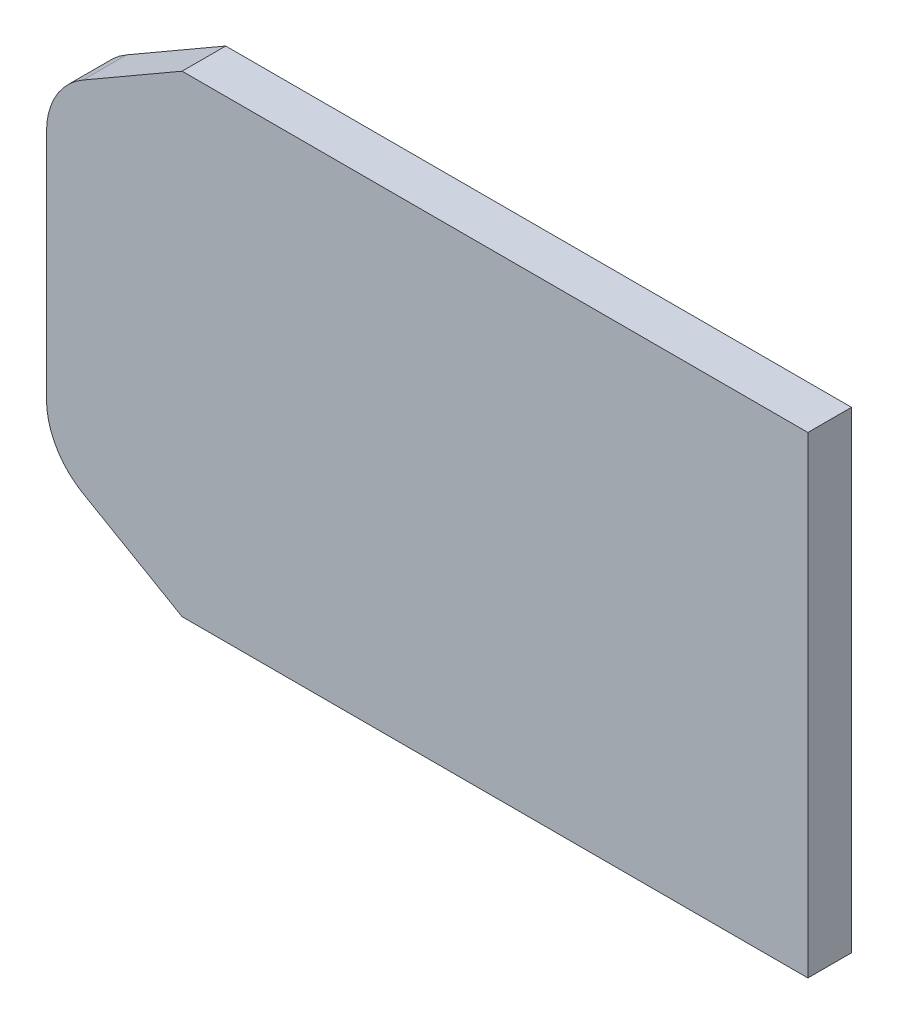
ISO-10303-21;
HEADER;
FILE_DESCRIPTION(('STEP AP214'),'2;1');
FILE_NAME('part.step','',(''),(''),'','','');
FILE_SCHEMA(('AUTOMOTIVE_DESIGN { 1 0 10303 214 1 1 1 1 }'));
ENDSEC;
DATA;
#1=APPLICATION_CONTEXT('core data for automotive mechanical design processes');
#2=APPLICATION_PROTOCOL_DEFINITION('international standard','automotive_design',2000,#1);
#3=PRODUCT_CONTEXT('',#1,'mechanical');
#4=PRODUCT('Part','Part','',(#3));
#5=PRODUCT_RELATED_PRODUCT_CATEGORY('part','',(#4));
#6=PRODUCT_DEFINITION_FORMATION('','',#4);
#7=PRODUCT_DEFINITION_CONTEXT('part definition',#1,'design');
#8=PRODUCT_DEFINITION('design','',#6,#7);
#9=PRODUCT_DEFINITION_SHAPE('','',#8);
#10=(LENGTH_UNIT() NAMED_UNIT(*) SI_UNIT(.MILLI.,.METRE.));
#11=(NAMED_UNIT(*) PLANE_ANGLE_UNIT() SI_UNIT($,.RADIAN.));
#12=(NAMED_UNIT(*) SI_UNIT($,.STERADIAN.) SOLID_ANGLE_UNIT());
#13=UNCERTAINTY_MEASURE_WITH_UNIT(LENGTH_MEASURE(1.E-05),#10,'distance_accuracy_value','');
#14=(GEOMETRIC_REPRESENTATION_CONTEXT(3) GLOBAL_UNCERTAINTY_ASSIGNED_CONTEXT((#13)) GLOBAL_UNIT_ASSIGNED_CONTEXT((#10,
#11,#12)) REPRESENTATION_CONTEXT('',''));
#15=CARTESIAN_POINT('',(0.,0.,0.));
#16=DIRECTION('',(0.,0.,1.));
#17=DIRECTION('',(1.,0.,0.));
#18=AXIS2_PLACEMENT_3D('',#15,#16,#17);
#19=CARTESIAN_POINT('',(-37.7876425318327,242.932576410757,6.));
#20=DIRECTION('',(-1.,0.,0.));
#21=DIRECTION('',(0.,-1.,0.));
#22=AXIS2_PLACEMENT_3D('',#19,#20,#21);
#23=PLANE('',#22);
#24=DIRECTION('',(0.,1.,0.));
#25=VECTOR('',#24,1.);
#26=CARTESIAN_POINT('',(-37.7876425318327,242.932576410757,0.));
#27=LINE('',#26,#25);
#28=CARTESIAN_POINT('',(-37.7876425318327,242.932576410757,0.));
#29=VERTEX_POINT('',#28);
#30=CARTESIAN_POINT('',(-37.7876425318328,307.932576410758,0.));
#31=VERTEX_POINT('',#30);
#32=EDGE_CURVE('E146',#29,#31,#27,.T.);
#33=ORIENTED_EDGE('',*,*,#32,.T.);
#34=DIRECTION('',(0.,0.,-1.));
#35=VECTOR('',#34,1.);
#36=CARTESIAN_POINT('',(-37.7876425318328,307.932576410758,6.));
#37=LINE('',#36,#35);
#38=CARTESIAN_POINT('',(-37.7876425318328,307.932576410758,6.));
#39=VERTEX_POINT('',#38);
#40=EDGE_CURVE('E11',#39,#31,#37,.T.);
#41=ORIENTED_EDGE('',*,*,#40,.F.);
#42=DIRECTION('',(0.,1.,0.));
#43=VECTOR('',#42,1.);
#44=CARTESIAN_POINT('',(-37.7876425318327,242.932576410757,6.));
#45=LINE('',#44,#43);
#46=CARTESIAN_POINT('',(-37.7876425318327,242.932576410757,6.));
#47=VERTEX_POINT('',#46);
#48=EDGE_CURVE('E168',#47,#39,#45,.T.);
#49=ORIENTED_EDGE('',*,*,#48,.F.);
#50=DIRECTION('',(0.,0.,-1.));
#51=VECTOR('',#50,1.);
#52=CARTESIAN_POINT('',(-37.7876425318327,242.932576410757,6.));
#53=LINE('',#52,#51);
#54=EDGE_CURVE('E142',#47,#29,#53,.T.);
#55=ORIENTED_EDGE('',*,*,#54,.T.);
#56=EDGE_LOOP('',(#33,#41,#49,#55));
#57=FACE_BOUND('',#56,.T.);
#58=ADVANCED_FACE('F45',(#57),#23,.F.);
#59=CARTESIAN_POINT('',(-37.7876425318328,307.932576410758,6.));
#60=DIRECTION('',(0.,-1.,0.));
#61=DIRECTION('',(1.,0.,0.));
#62=AXIS2_PLACEMENT_3D('',#59,#60,#61);
#63=PLANE('',#62);
#64=DIRECTION('',(-1.,0.,0.));
#65=VECTOR('',#64,1.);
#66=CARTESIAN_POINT('',(-37.7876425318328,307.932576410758,0.));
#67=LINE('',#66,#65);
#68=CARTESIAN_POINT('',(-123.887642531833,307.932576410757,0.));
#69=VERTEX_POINT('',#68);
#70=EDGE_CURVE('E150',#31,#69,#67,.T.);
#71=ORIENTED_EDGE('',*,*,#70,.T.);
#72=DIRECTION('',(0.,0.,-1.));
#73=VECTOR('',#72,1.);
#74=CARTESIAN_POINT('',(-123.887642531833,307.932576410757,6.));
#75=LINE('',#74,#73);
#76=CARTESIAN_POINT('',(-123.887642531833,307.932576410757,6.));
#77=VERTEX_POINT('',#76);
#78=EDGE_CURVE('E54',#77,#69,#75,.T.);
#79=ORIENTED_EDGE('',*,*,#78,.F.);
#80=DIRECTION('',(-1.,0.,0.));
#81=VECTOR('',#80,1.);
#82=CARTESIAN_POINT('',(-37.7876425318328,307.932576410758,6.));
#83=LINE('',#82,#81);
#84=EDGE_CURVE('E105',#39,#77,#83,.T.);
#85=ORIENTED_EDGE('',*,*,#84,.F.);
#86=ORIENTED_EDGE('',*,*,#40,.T.);
#87=EDGE_LOOP('',(#71,#79,#85,#86));
#88=FACE_BOUND('',#87,.T.);
#89=ADVANCED_FACE('F214',(#88),#63,.F.);
#90=CARTESIAN_POINT('',(-123.887642531833,307.932576410757,6.));
#91=DIRECTION('',(0.499974587811576,-0.866040075021153,0.));
#92=DIRECTION('',(0.866040075021154,0.499974587811576,0.));
#93=AXIS2_PLACEMENT_3D('',#90,#91,#92);
#94=PLANE('',#93);
#95=DIRECTION('',(-0.866040075021153,-0.499974587811576,0.));
#96=VECTOR('',#95,1.);
#97=CARTESIAN_POINT('',(-123.887642531833,307.932576410757,0.));
#98=LINE('',#97,#96);
#99=CARTESIAN_POINT('',(-137.545094514916,300.047977160969,0.));
#100=VERTEX_POINT('',#99);
#101=EDGE_CURVE('E153',#69,#100,#98,.T.);
#102=ORIENTED_EDGE('',*,*,#101,.T.);
#103=DIRECTION('',(0.,0.,-1.));
#104=VECTOR('',#103,1.);
#105=CARTESIAN_POINT('',(-137.545094514916,300.047977160969,6.));
#106=LINE('',#105,#104);
#107=CARTESIAN_POINT('',(-137.545094514916,300.047977160969,6.));
#108=VERTEX_POINT('',#107);
#109=EDGE_CURVE('E179',#108,#100,#106,.T.);
#110=ORIENTED_EDGE('',*,*,#109,.F.);
#111=DIRECTION('',(-0.866040075021153,-0.499974587811576,0.));
#112=VECTOR('',#111,1.);
#113=CARTESIAN_POINT('',(-123.887642531833,307.932576410757,6.));
#114=LINE('',#113,#112);
#115=EDGE_CURVE('E189',#77,#108,#114,.T.);
#116=ORIENTED_EDGE('',*,*,#115,.F.);
#117=ORIENTED_EDGE('',*,*,#78,.T.);
#118=EDGE_LOOP('',(#102,#110,#116,#117));
#119=FACE_BOUND('',#118,.T.);
#120=ADVANCED_FACE('F187',(#119),#94,.F.);
#121=CARTESIAN_POINT('',(-132.545348636801,291.387576410757,6.));
#122=DIRECTION('',(0.,0.,-1.));
#123=DIRECTION('',(-1.,0.,0.));
#124=AXIS2_PLACEMENT_3D('',#121,#122,#123);
#125=CYLINDRICAL_SURFACE('',#124,9.99999999999997);
#126=CARTESIAN_POINT('',(-132.545348636801,291.387576410757,0.));
#127=DIRECTION('',(0.,0.,1.));
#128=DIRECTION('',(1.,0.,0.));
#129=AXIS2_PLACEMENT_3D('',#126,#127,#128);
#130=CIRCLE('',#129,9.99999999999997);
#131=CARTESIAN_POINT('',(-142.545348636801,291.387576410757,0.));
#132=VERTEX_POINT('',#131);
#133=EDGE_CURVE('E156',#100,#132,#130,.T.);
#134=ORIENTED_EDGE('',*,*,#133,.T.);
#135=DIRECTION('',(0.,0.,-1.));
#136=VECTOR('',#135,1.);
#137=CARTESIAN_POINT('',(-142.545348636801,291.387576410757,6.));
#138=LINE('',#137,#136);
#139=CARTESIAN_POINT('',(-142.545348636801,291.387576410757,6.));
#140=VERTEX_POINT('',#139);
#141=EDGE_CURVE('E175',#140,#132,#138,.T.);
#142=ORIENTED_EDGE('',*,*,#141,.F.);
#143=CARTESIAN_POINT('',(-132.545348636801,291.387576410757,6.));
#144=DIRECTION('',(0.,0.,1.));
#145=DIRECTION('',(1.,0.,0.));
#146=AXIS2_PLACEMENT_3D('',#143,#144,#145);
#147=CIRCLE('',#146,9.99999999999997);
#148=EDGE_CURVE('E202',#108,#140,#147,.T.);
#149=ORIENTED_EDGE('',*,*,#148,.F.);
#150=ORIENTED_EDGE('',*,*,#109,.T.);
#151=EDGE_LOOP('',(#134,#142,#149,#150));
#152=FACE_BOUND('',#151,.T.);
#153=ADVANCED_FACE('F197',(#152),#125,.T.);
#154=CARTESIAN_POINT('',(-142.545348636801,259.477576410757,6.));
#155=DIRECTION('',(1.,0.,0.));
#156=DIRECTION('',(0.,0.,-1.));
#157=AXIS2_PLACEMENT_3D('',#154,#155,#156);
#158=PLANE('',#157);
#159=DIRECTION('',(0.,-1.,0.));
#160=VECTOR('',#159,1.);
#161=CARTESIAN_POINT('',(-142.545348636801,259.477576410757,0.));
#162=LINE('',#161,#160);
#163=CARTESIAN_POINT('',(-142.545348636801,259.477576410757,0.));
#164=VERTEX_POINT('',#163);
#165=EDGE_CURVE('E159',#132,#164,#162,.T.);
#166=ORIENTED_EDGE('',*,*,#165,.T.);
#167=DIRECTION('',(0.,0.,-1.));
#168=VECTOR('',#167,1.);
#169=CARTESIAN_POINT('',(-142.545348636801,259.477576410757,6.));
#170=LINE('',#169,#168);
#171=CARTESIAN_POINT('',(-142.545348636801,259.477576410757,6.));
#172=VERTEX_POINT('',#171);
#173=EDGE_CURVE('E135',#172,#164,#170,.T.);
#174=ORIENTED_EDGE('',*,*,#173,.F.);
#175=DIRECTION('',(0.,-1.,0.));
#176=VECTOR('',#175,1.);
#177=CARTESIAN_POINT('',(-142.545348636801,259.477576410757,6.));
#178=LINE('',#177,#176);
#179=EDGE_CURVE('E124',#140,#172,#178,.T.);
#180=ORIENTED_EDGE('',*,*,#179,.F.);
#181=ORIENTED_EDGE('',*,*,#141,.T.);
#182=EDGE_LOOP('',(#166,#174,#180,#181));
#183=FACE_BOUND('',#182,.T.);
#184=ADVANCED_FACE('F200',(#183),#158,.F.);
#185=CARTESIAN_POINT('',(-132.545348636801,259.477576410757,6.));
#186=DIRECTION('',(0.,0.,-1.));
#187=DIRECTION('',(-1.,0.,0.));
#188=AXIS2_PLACEMENT_3D('',#185,#186,#187);
#189=CYLINDRICAL_SURFACE('',#188,10.);
#190=CARTESIAN_POINT('',(-132.545348636801,259.477576410757,0.));
#191=DIRECTION('',(0.,0.,1.));
#192=DIRECTION('',(-1.,0.,0.));
#193=AXIS2_PLACEMENT_3D('',#190,#191,#192);
#194=CIRCLE('',#193,10.);
#195=CARTESIAN_POINT('',(-137.545094514916,250.817175660545,0.));
#196=VERTEX_POINT('',#195);
#197=EDGE_CURVE('E133',#164,#196,#194,.T.);
#198=ORIENTED_EDGE('',*,*,#197,.T.);
#199=DIRECTION('',(0.,0.,-1.));
#200=VECTOR('',#199,1.);
#201=CARTESIAN_POINT('',(-137.545094514916,250.817175660545,6.));
#202=LINE('',#201,#200);
#203=CARTESIAN_POINT('',(-137.545094514916,250.817175660545,6.));
#204=VERTEX_POINT('',#203);
#205=EDGE_CURVE('E130',#204,#196,#202,.T.);
#206=ORIENTED_EDGE('',*,*,#205,.F.);
#207=CARTESIAN_POINT('',(-132.545348636801,259.477576410757,6.));
#208=DIRECTION('',(0.,0.,1.));
#209=DIRECTION('',(-1.,0.,0.));
#210=AXIS2_PLACEMENT_3D('',#207,#208,#209);
#211=CIRCLE('',#210,10.);
#212=EDGE_CURVE('E118',#172,#204,#211,.T.);
#213=ORIENTED_EDGE('',*,*,#212,.F.);
#214=ORIENTED_EDGE('',*,*,#173,.T.);
#215=EDGE_LOOP('',(#198,#206,#213,#214));
#216=FACE_BOUND('',#215,.T.);
#217=ADVANCED_FACE('F131',(#216),#189,.T.);
#218=CARTESIAN_POINT('',(-123.887642531833,242.932576410757,6.));
#219=DIRECTION('',(0.499974587811572,0.866040075021156,0.));
#220=DIRECTION('',(-0.866040075021156,0.499974587811572,0.));
#221=AXIS2_PLACEMENT_3D('',#218,#219,#220);
#222=PLANE('',#221);
#223=DIRECTION('',(0.866040075021156,-0.499974587811572,0.));
#224=VECTOR('',#223,1.);
#225=CARTESIAN_POINT('',(-123.887642531833,242.932576410757,0.));
#226=LINE('',#225,#224);
#227=CARTESIAN_POINT('',(-123.887642531833,242.932576410757,0.));
#228=VERTEX_POINT('',#227);
#229=EDGE_CURVE('E91',#196,#228,#226,.T.);
#230=ORIENTED_EDGE('',*,*,#229,.T.);
#231=DIRECTION('',(0.,0.,-1.));
#232=VECTOR('',#231,1.);
#233=CARTESIAN_POINT('',(-123.887642531833,242.932576410757,6.));
#234=LINE('',#233,#232);
#235=CARTESIAN_POINT('',(-123.887642531833,242.932576410757,6.));
#236=VERTEX_POINT('',#235);
#237=EDGE_CURVE('E136',#236,#228,#234,.T.);
#238=ORIENTED_EDGE('',*,*,#237,.F.);
#239=DIRECTION('',(0.866040075021156,-0.499974587811572,0.));
#240=VECTOR('',#239,1.);
#241=CARTESIAN_POINT('',(-123.887642531833,242.932576410757,6.));
#242=LINE('',#241,#240);
#243=EDGE_CURVE('E122',#204,#236,#242,.T.);
#244=ORIENTED_EDGE('',*,*,#243,.F.);
#245=ORIENTED_EDGE('',*,*,#205,.T.);
#246=EDGE_LOOP('',(#230,#238,#244,#245));
#247=FACE_BOUND('',#246,.T.);
#248=ADVANCED_FACE('F138',(#247),#222,.F.);
#249=CARTESIAN_POINT('',(-37.7876425318327,242.932576410757,6.));
#250=DIRECTION('',(0.,1.,0.));
#251=DIRECTION('',(-1.,0.,0.));
#252=AXIS2_PLACEMENT_3D('',#249,#250,#251);
#253=PLANE('',#252);
#254=DIRECTION('',(1.,0.,0.));
#255=VECTOR('',#254,1.);
#256=CARTESIAN_POINT('',(-37.7876425318327,242.932576410757,0.));
#257=LINE('',#256,#255);
#258=EDGE_CURVE('E97',#228,#29,#257,.T.);
#259=ORIENTED_EDGE('',*,*,#258,.T.);
#260=ORIENTED_EDGE('',*,*,#54,.F.);
#261=DIRECTION('',(1.,0.,0.));
#262=VECTOR('',#261,1.);
#263=CARTESIAN_POINT('',(-37.7876425318327,242.932576410757,6.));
#264=LINE('',#263,#262);
#265=EDGE_CURVE('E62',#236,#47,#264,.T.);
#266=ORIENTED_EDGE('',*,*,#265,.F.);
#267=ORIENTED_EDGE('',*,*,#237,.T.);
#268=EDGE_LOOP('',(#259,#260,#266,#267));
#269=FACE_BOUND('',#268,.T.);
#270=ADVANCED_FACE('F230',(#269),#253,.F.);
#271=CARTESIAN_POINT('',(-132.545348636801,291.387576410757,6.));
#272=DIRECTION('',(0.,0.,1.));
#273=DIRECTION('',(1.,0.,0.));
#274=AXIS2_PLACEMENT_3D('',#271,#272,#273);
#275=PLANE('',#274);
#276=ORIENTED_EDGE('',*,*,#48,.T.);
#277=ORIENTED_EDGE('',*,*,#84,.T.);
#278=ORIENTED_EDGE('',*,*,#115,.T.);
#279=ORIENTED_EDGE('',*,*,#148,.T.);
#280=ORIENTED_EDGE('',*,*,#179,.T.);
#281=ORIENTED_EDGE('',*,*,#212,.T.);
#282=ORIENTED_EDGE('',*,*,#243,.T.);
#283=ORIENTED_EDGE('',*,*,#265,.T.);
#284=EDGE_LOOP('',(#276,#277,#278,#279,#280,#281,#282,#283));
#285=FACE_BOUND('',#284,.T.);
#286=ADVANCED_FACE('F120',(#285),#275,.T.);
#287=CARTESIAN_POINT('',(-132.545348636801,291.387576410757,0.));
#288=DIRECTION('',(0.,0.,1.));
#289=DIRECTION('',(1.,0.,0.));
#290=AXIS2_PLACEMENT_3D('',#287,#288,#289);
#291=PLANE('',#290);
#292=ORIENTED_EDGE('',*,*,#32,.F.);
#293=ORIENTED_EDGE('',*,*,#258,.F.);
#294=ORIENTED_EDGE('',*,*,#229,.F.);
#295=ORIENTED_EDGE('',*,*,#197,.F.);
#296=ORIENTED_EDGE('',*,*,#165,.F.);
#297=ORIENTED_EDGE('',*,*,#133,.F.);
#298=ORIENTED_EDGE('',*,*,#101,.F.);
#299=ORIENTED_EDGE('',*,*,#70,.F.);
#300=EDGE_LOOP('',(#292,#293,#294,#295,#296,#297,#298,#299));
#301=FACE_BOUND('',#300,.T.);
#302=ADVANCED_FACE('F193',(#301),#291,.F.);
#303=CLOSED_SHELL('',(#58,#89,#120,#153,#184,#217,#248,#270,#286,#302));
#304=MANIFOLD_SOLID_BREP('B2',#303);
#305=ADVANCED_BREP_SHAPE_REPRESENTATION('',(#18,#304),#14);
#306=SHAPE_DEFINITION_REPRESENTATION(#9,#305);
ENDSEC;
END-ISO-10303-21;
